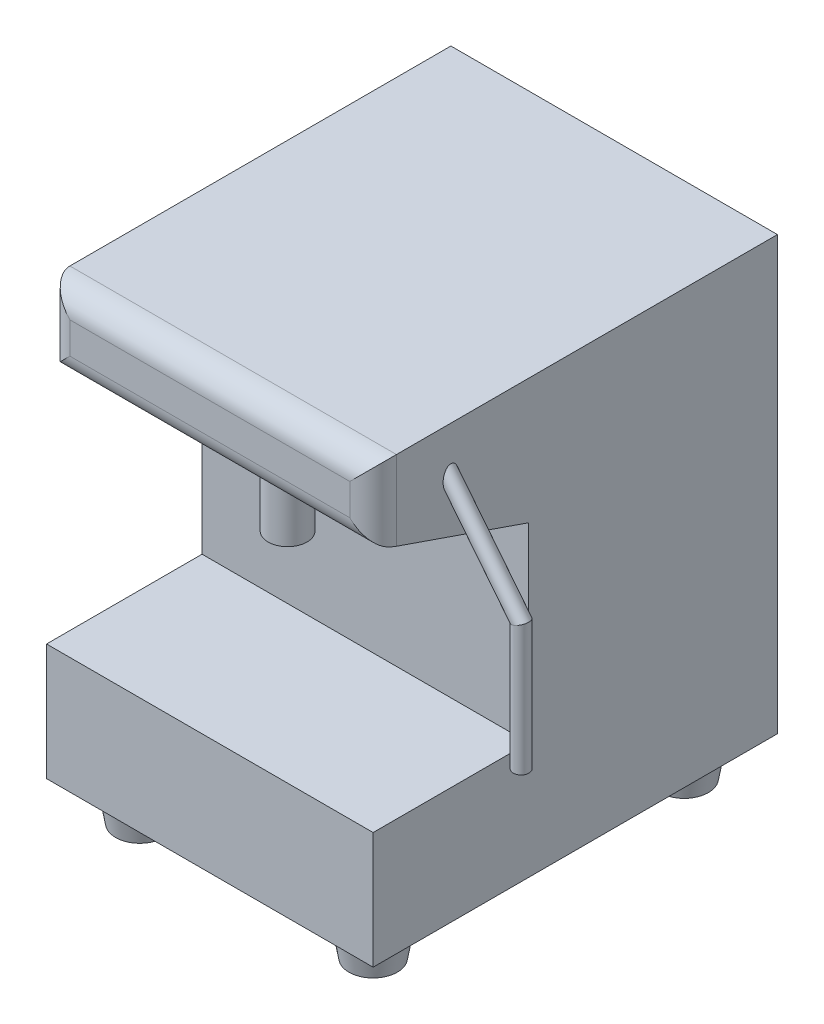
ISO-10303-21;
HEADER;
FILE_DESCRIPTION(('STEP AP214'),'2;1');
FILE_NAME('part.step','',(''),(''),'','','');
FILE_SCHEMA(('AUTOMOTIVE_DESIGN { 1 0 10303 214 1 1 1 1 }'));
ENDSEC;
DATA;
#1=APPLICATION_CONTEXT('core data for automotive mechanical design processes');
#2=APPLICATION_PROTOCOL_DEFINITION('international standard','automotive_design',2000,#1);
#3=PRODUCT_CONTEXT('',#1,'mechanical');
#4=PRODUCT('Part','Part','',(#3));
#5=PRODUCT_RELATED_PRODUCT_CATEGORY('part','',(#4));
#6=PRODUCT_DEFINITION_FORMATION('','',#4);
#7=PRODUCT_DEFINITION_CONTEXT('part definition',#1,'design');
#8=PRODUCT_DEFINITION('design','',#6,#7);
#9=PRODUCT_DEFINITION_SHAPE('','',#8);
#10=(LENGTH_UNIT() NAMED_UNIT(*) SI_UNIT(.MILLI.,.METRE.));
#11=(NAMED_UNIT(*) PLANE_ANGLE_UNIT() SI_UNIT($,.RADIAN.));
#12=(NAMED_UNIT(*) SI_UNIT($,.STERADIAN.) SOLID_ANGLE_UNIT());
#13=UNCERTAINTY_MEASURE_WITH_UNIT(LENGTH_MEASURE(1.E-05),#10,'distance_accuracy_value','');
#14=(GEOMETRIC_REPRESENTATION_CONTEXT(3) GLOBAL_UNCERTAINTY_ASSIGNED_CONTEXT((#13)) GLOBAL_UNIT_ASSIGNED_CONTEXT((#10,
#11,#12)) REPRESENTATION_CONTEXT('',''));
#15=CARTESIAN_POINT('',(0.,0.,0.));
#16=DIRECTION('',(0.,0.,1.));
#17=DIRECTION('',(1.,0.,0.));
#18=AXIS2_PLACEMENT_3D('',#15,#16,#17);
#19=CARTESIAN_POINT('',(0.,556.,0.));
#20=DIRECTION('',(0.,0.,-1.));
#21=DIRECTION('',(-1.,0.,0.));
#22=AXIS2_PLACEMENT_3D('',#19,#20,#21);
#23=PLANE('',#22);
#24=DIRECTION('',(0.,-1.,0.));
#25=VECTOR('',#24,1.);
#26=CARTESIAN_POINT('',(390.,556.,0.));
#27=LINE('',#26,#25);
#28=CARTESIAN_POINT('',(390.,485.558611887792,0.));
#29=VERTEX_POINT('',#28);
#30=CARTESIAN_POINT('',(390.,526.,0.));
#31=VERTEX_POINT('',#30);
#32=EDGE_CURVE('E178',#29,#31,#27,.F.);
#33=ORIENTED_EDGE('',*,*,#32,.T.);
#34=DIRECTION('',(1.,0.,0.));
#35=VECTOR('',#34,1.);
#36=CARTESIAN_POINT('',(0.,526.,0.));
#37=LINE('',#36,#35);
#38=CARTESIAN_POINT('',(30.,526.,0.));
#39=VERTEX_POINT('',#38);
#40=EDGE_CURVE('E181',#31,#39,#37,.F.);
#41=ORIENTED_EDGE('',*,*,#40,.T.);
#42=DIRECTION('',(0.,-1.,0.));
#43=VECTOR('',#42,1.);
#44=CARTESIAN_POINT('',(30.,556.,0.));
#45=LINE('',#44,#43);
#46=CARTESIAN_POINT('',(30.,485.558611887792,0.));
#47=VERTEX_POINT('',#46);
#48=EDGE_CURVE('E167',#39,#47,#45,.T.);
#49=ORIENTED_EDGE('',*,*,#48,.T.);
#50=DIRECTION('',(1.,0.,0.));
#51=VECTOR('',#50,1.);
#52=CARTESIAN_POINT('',(0.,485.558611887792,0.));
#53=LINE('',#52,#51);
#54=EDGE_CURVE('E175',#47,#29,#53,.T.);
#55=ORIENTED_EDGE('',*,*,#54,.T.);
#56=EDGE_LOOP('',(#33,#41,#49,#55));
#57=FACE_BOUND('',#56,.T.);
#58=ADVANCED_FACE('F48',(#57),#23,.F.);
#59=CARTESIAN_POINT('',(0.,556.,0.));
#60=DIRECTION('',(1.,0.,0.));
#61=DIRECTION('',(0.,0.,-1.));
#62=AXIS2_PLACEMENT_3D('',#59,#60,#61);
#63=PLANE('',#62);
#64=DIRECTION('',(0.,0.326950789305376,0.945041364900284));
#65=VECTOR('',#64,1.);
#66=CARTESIAN_POINT('',(0.,464.192905506284,0.));
#67=LINE('',#66,#65);
#68=CARTESIAN_POINT('',(0.,395.,-200.));
#69=VERTEX_POINT('',#68);
#70=CARTESIAN_POINT('',(0.,453.813969680342,-30.));
#71=VERTEX_POINT('',#70);
#72=EDGE_CURVE('E153',#69,#71,#67,.T.);
#73=ORIENTED_EDGE('',*,*,#72,.T.);
#74=DIRECTION('',(0.,-1.,0.));
#75=VECTOR('',#74,1.);
#76=CARTESIAN_POINT('',(0.,556.,-30.));
#77=LINE('',#76,#75);
#78=CARTESIAN_POINT('',(0.,556.,-30.));
#79=VERTEX_POINT('',#78);
#80=EDGE_CURVE('E12',#71,#79,#77,.F.);
#81=ORIENTED_EDGE('',*,*,#80,.T.);
#82=DIRECTION('',(0.,0.,1.));
#83=VECTOR('',#82,1.);
#84=CARTESIAN_POINT('',(0.,556.,0.));
#85=LINE('',#84,#83);
#86=CARTESIAN_POINT('',(0.,556.,-520.));
#87=VERTEX_POINT('',#86);
#88=EDGE_CURVE('E229',#87,#79,#85,.T.);
#89=ORIENTED_EDGE('',*,*,#88,.F.);
#90=DIRECTION('',(0.,-1.,0.));
#91=VECTOR('',#90,1.);
#92=CARTESIAN_POINT('',(0.,556.,-520.));
#93=LINE('',#92,#91);
#94=CARTESIAN_POINT('',(0.,0.,-520.));
#95=VERTEX_POINT('',#94);
#96=EDGE_CURVE('E240',#87,#95,#93,.T.);
#97=ORIENTED_EDGE('',*,*,#96,.T.);
#98=DIRECTION('',(0.,0.,1.));
#99=VECTOR('',#98,1.);
#100=CARTESIAN_POINT('',(0.,0.,0.));
#101=LINE('',#100,#99);
#102=CARTESIAN_POINT('',(0.,0.,0.));
#103=VERTEX_POINT('',#102);
#104=EDGE_CURVE('E160',#95,#103,#101,.T.);
#105=ORIENTED_EDGE('',*,*,#104,.T.);
#106=DIRECTION('',(0.,-1.,0.));
#107=VECTOR('',#106,1.);
#108=CARTESIAN_POINT('',(0.,556.,0.));
#109=LINE('',#108,#107);
#110=CARTESIAN_POINT('',(0.,150.,0.));
#111=VERTEX_POINT('',#110);
#112=EDGE_CURVE('E149',#111,#103,#109,.T.);
#113=ORIENTED_EDGE('',*,*,#112,.F.);
#114=DIRECTION('',(0.,0.,-1.));
#115=VECTOR('',#114,1.);
#116=CARTESIAN_POINT('',(0.,150.,0.));
#117=LINE('',#116,#115);
#118=CARTESIAN_POINT('',(0.,150.,-200.));
#119=VERTEX_POINT('',#118);
#120=EDGE_CURVE('E130',#111,#119,#117,.T.);
#121=ORIENTED_EDGE('',*,*,#120,.T.);
#122=DIRECTION('',(0.,1.,0.));
#123=VECTOR('',#122,1.);
#124=CARTESIAN_POINT('',(0.,150.,-200.));
#125=LINE('',#124,#123);
#126=EDGE_CURVE('E142',#119,#69,#125,.T.);
#127=ORIENTED_EDGE('',*,*,#126,.T.);
#128=EDGE_LOOP('',(#73,#81,#89,#97,#105,#113,#121,#127));
#129=FACE_BOUND('',#128,.T.);
#130=ADVANCED_FACE('F157',(#129),#63,.F.);
#131=DIRECTION('',(0.,-1.,0.));
#132=VECTOR('',#131,1.);
#133=CARTESIAN_POINT('',(420.,556.,0.));
#134=LINE('',#133,#132);
#135=CARTESIAN_POINT('',(420.,150.,0.));
#136=VERTEX_POINT('',#135);
#137=CARTESIAN_POINT('',(420.,0.,0.));
#138=VERTEX_POINT('',#137);
#139=EDGE_CURVE('E151',#136,#138,#134,.T.);
#140=ORIENTED_EDGE('',*,*,#139,.F.);
#141=DIRECTION('',(1.,0.,0.));
#142=VECTOR('',#141,1.);
#143=CARTESIAN_POINT('',(0.,150.,0.));
#144=LINE('',#143,#142);
#145=EDGE_CURVE('E134',#111,#136,#144,.T.);
#146=ORIENTED_EDGE('',*,*,#145,.F.);
#147=ORIENTED_EDGE('',*,*,#112,.T.);
#148=DIRECTION('',(1.,0.,0.));
#149=VECTOR('',#148,1.);
#150=CARTESIAN_POINT('',(0.,0.,0.));
#151=LINE('',#150,#149);
#152=EDGE_CURVE('E243',#103,#138,#151,.T.);
#153=ORIENTED_EDGE('',*,*,#152,.T.);
#154=EDGE_LOOP('',(#140,#146,#147,#153));
#155=FACE_BOUND('',#154,.T.);
#156=ADVANCED_FACE('F147',(#155),#23,.F.);
#157=CARTESIAN_POINT('',(420.,556.,0.));
#158=DIRECTION('',(-1.,0.,0.));
#159=DIRECTION('',(0.,0.,1.));
#160=AXIS2_PLACEMENT_3D('',#157,#158,#159);
#161=PLANE('',#160);
#162=CARTESIAN_POINT('',(420.,494.703752628212,-100.));
#163=DIRECTION('',(-1.,0.,0.));
#164=DIRECTION('',(0.,-1.,0.));
#165=AXIS2_PLACEMENT_3D('',#162,#163,#164);
#166=ELLIPSE('',#165,16.0713877847574,10.);
#167=CARTESIAN_POINT('',(420.,478.632364843454,-100.));
#168=VERTEX_POINT('',#167);
#169=EDGE_CURVE('E308',#168,#168,#166,.T.);
#170=ORIENTED_EDGE('',*,*,#169,.T.);
#171=EDGE_LOOP('',(#170));
#172=FACE_BOUND('',#171,.T.);
#173=DIRECTION('',(0.,0.,-1.));
#174=VECTOR('',#173,1.);
#175=CARTESIAN_POINT('',(420.,556.,0.));
#176=LINE('',#175,#174);
#177=CARTESIAN_POINT('',(420.,556.,-30.));
#178=VERTEX_POINT('',#177);
#179=CARTESIAN_POINT('',(420.,556.,-520.));
#180=VERTEX_POINT('',#179);
#181=EDGE_CURVE('E233',#178,#180,#176,.T.);
#182=ORIENTED_EDGE('',*,*,#181,.F.);
#183=DIRECTION('',(0.,-1.,0.));
#184=VECTOR('',#183,1.);
#185=CARTESIAN_POINT('',(420.,556.,-30.));
#186=LINE('',#185,#184);
#187=CARTESIAN_POINT('',(420.,453.813969680342,-30.));
#188=VERTEX_POINT('',#187);
#189=EDGE_CURVE('E185',#178,#188,#186,.T.);
#190=ORIENTED_EDGE('',*,*,#189,.T.);
#191=DIRECTION('',(0.,0.326950789305376,0.945041364900284));
#192=VECTOR('',#191,1.);
#193=CARTESIAN_POINT('',(420.,464.192905506284,0.));
#194=LINE('',#193,#192);
#195=CARTESIAN_POINT('',(420.,395.,-200.));
#196=VERTEX_POINT('',#195);
#197=EDGE_CURVE('E143',#196,#188,#194,.T.);
#198=ORIENTED_EDGE('',*,*,#197,.F.);
#199=DIRECTION('',(0.,1.,0.));
#200=VECTOR('',#199,1.);
#201=CARTESIAN_POINT('',(420.,150.,-200.));
#202=LINE('',#201,#200);
#203=CARTESIAN_POINT('',(420.,150.,-200.));
#204=VERTEX_POINT('',#203);
#205=EDGE_CURVE('E213',#204,#196,#202,.T.);
#206=ORIENTED_EDGE('',*,*,#205,.F.);
#207=DIRECTION('',(0.,0.,-1.));
#208=VECTOR('',#207,1.);
#209=CARTESIAN_POINT('',(420.,150.,0.));
#210=LINE('',#209,#208);
#211=EDGE_CURVE('E208',#136,#204,#210,.T.);
#212=ORIENTED_EDGE('',*,*,#211,.F.);
#213=ORIENTED_EDGE('',*,*,#139,.T.);
#214=DIRECTION('',(0.,0.,-1.));
#215=VECTOR('',#214,1.);
#216=CARTESIAN_POINT('',(420.,0.,0.));
#217=LINE('',#216,#215);
#218=CARTESIAN_POINT('',(420.,0.,-520.));
#219=VERTEX_POINT('',#218);
#220=EDGE_CURVE('E246',#138,#219,#217,.T.);
#221=ORIENTED_EDGE('',*,*,#220,.T.);
#222=DIRECTION('',(0.,-1.,0.));
#223=VECTOR('',#222,1.);
#224=CARTESIAN_POINT('',(420.,556.,-520.));
#225=LINE('',#224,#223);
#226=EDGE_CURVE('E169',#180,#219,#225,.T.);
#227=ORIENTED_EDGE('',*,*,#226,.F.);
#228=EDGE_LOOP('',(#182,#190,#198,#206,#212,#213,#221,#227));
#229=FACE_BOUND('',#228,.T.);
#230=ADVANCED_FACE('F265',(#172,#229),#161,.F.);
#231=CARTESIAN_POINT('',(0.,556.,-520.));
#232=DIRECTION('',(0.,0.,1.));
#233=DIRECTION('',(1.,0.,0.));
#234=AXIS2_PLACEMENT_3D('',#231,#232,#233);
#235=PLANE('',#234);
#236=DIRECTION('',(-1.,0.,0.));
#237=VECTOR('',#236,1.);
#238=CARTESIAN_POINT('',(0.,0.,-520.));
#239=LINE('',#238,#237);
#240=EDGE_CURVE('E234',#219,#95,#239,.T.);
#241=ORIENTED_EDGE('',*,*,#240,.T.);
#242=ORIENTED_EDGE('',*,*,#96,.F.);
#243=DIRECTION('',(-1.,0.,0.));
#244=VECTOR('',#243,1.);
#245=CARTESIAN_POINT('',(0.,556.,-520.));
#246=LINE('',#245,#244);
#247=EDGE_CURVE('E237',#180,#87,#246,.T.);
#248=ORIENTED_EDGE('',*,*,#247,.F.);
#249=ORIENTED_EDGE('',*,*,#226,.T.);
#250=EDGE_LOOP('',(#241,#242,#248,#249));
#251=FACE_BOUND('',#250,.T.);
#252=ADVANCED_FACE('F258',(#251),#235,.F.);
#253=CARTESIAN_POINT('',(0.,556.,0.));
#254=DIRECTION('',(0.,-1.,0.));
#255=DIRECTION('',(0.,0.,-1.));
#256=AXIS2_PLACEMENT_3D('',#253,#254,#255);
#257=PLANE('',#256);
#258=ORIENTED_EDGE('',*,*,#88,.T.);
#259=DIRECTION('',(1.,0.,0.));
#260=VECTOR('',#259,1.);
#261=CARTESIAN_POINT('',(0.,556.,-30.));
#262=LINE('',#261,#260);
#263=EDGE_CURVE('E162',#79,#178,#262,.T.);
#264=ORIENTED_EDGE('',*,*,#263,.T.);
#265=ORIENTED_EDGE('',*,*,#181,.T.);
#266=ORIENTED_EDGE('',*,*,#247,.T.);
#267=EDGE_LOOP('',(#258,#264,#265,#266));
#268=FACE_BOUND('',#267,.T.);
#269=ADVANCED_FACE('F352',(#268),#257,.F.);
#270=CARTESIAN_POINT('',(0.,0.,0.));
#271=DIRECTION('',(0.,-1.,0.));
#272=DIRECTION('',(0.,0.,-1.));
#273=AXIS2_PLACEMENT_3D('',#270,#271,#272);
#274=PLANE('',#273);
#275=CARTESIAN_POINT('',(60.,0.,-460.));
#276=DIRECTION('',(0.,-1.,0.));
#277=DIRECTION('',(0.,0.,1.));
#278=AXIS2_PLACEMENT_3D('',#275,#276,#277);
#279=CIRCLE('',#278,40.);
#280=CARTESIAN_POINT('',(60.,0.,-420.));
#281=VERTEX_POINT('',#280);
#282=EDGE_CURVE('E296',#281,#281,#279,.T.);
#283=ORIENTED_EDGE('',*,*,#282,.F.);
#284=EDGE_LOOP('',(#283));
#285=FACE_BOUND('',#284,.T.);
#286=CARTESIAN_POINT('',(360.,0.,-460.));
#287=DIRECTION('',(0.,-1.,0.));
#288=DIRECTION('',(0.,0.,-1.));
#289=AXIS2_PLACEMENT_3D('',#286,#287,#288);
#290=CIRCLE('',#289,40.);
#291=CARTESIAN_POINT('',(360.,0.,-500.));
#292=VERTEX_POINT('',#291);
#293=EDGE_CURVE('E288',#292,#292,#290,.T.);
#294=ORIENTED_EDGE('',*,*,#293,.F.);
#295=EDGE_LOOP('',(#294));
#296=FACE_BOUND('',#295,.T.);
#297=CARTESIAN_POINT('',(360.,0.,-60.));
#298=DIRECTION('',(0.,-1.,0.));
#299=DIRECTION('',(0.,0.,1.));
#300=AXIS2_PLACEMENT_3D('',#297,#298,#299);
#301=CIRCLE('',#300,40.);
#302=CARTESIAN_POINT('',(360.,0.,-20.));
#303=VERTEX_POINT('',#302);
#304=EDGE_CURVE('E280',#303,#303,#301,.T.);
#305=ORIENTED_EDGE('',*,*,#304,.F.);
#306=EDGE_LOOP('',(#305));
#307=FACE_BOUND('',#306,.T.);
#308=CARTESIAN_POINT('',(60.,0.,-60.));
#309=DIRECTION('',(0.,-1.,0.));
#310=DIRECTION('',(0.,0.,-1.));
#311=AXIS2_PLACEMENT_3D('',#308,#309,#310);
#312=CIRCLE('',#311,40.);
#313=CARTESIAN_POINT('',(60.,0.,-100.));
#314=VERTEX_POINT('',#313);
#315=EDGE_CURVE('E276',#314,#314,#312,.T.);
#316=ORIENTED_EDGE('',*,*,#315,.F.);
#317=EDGE_LOOP('',(#316));
#318=FACE_BOUND('',#317,.T.);
#319=ORIENTED_EDGE('',*,*,#104,.F.);
#320=ORIENTED_EDGE('',*,*,#240,.F.);
#321=ORIENTED_EDGE('',*,*,#220,.F.);
#322=ORIENTED_EDGE('',*,*,#152,.F.);
#323=EDGE_LOOP('',(#319,#320,#321,#322));
#324=FACE_BOUND('',#323,.T.);
#325=ADVANCED_FACE('F264',(#285,#296,#307,#318,#324),#274,.T.);
#326=CARTESIAN_POINT('',(0.,464.192905506284,0.));
#327=DIRECTION('',(0.,0.945041364900284,-0.326950789305376));
#328=DIRECTION('',(0.,0.326950789305376,0.945041364900284));
#329=AXIS2_PLACEMENT_3D('',#326,#327,#328);
#330=PLANE('',#329);
#331=CARTESIAN_POINT('',(210.,429.596452753142,-100.));
#332=DIRECTION('',(0.,0.945041364900284,-0.326950789305376));
#333=DIRECTION('',(0.,0.326950789305376,0.945041364900284));
#334=AXIS2_PLACEMENT_3D('',#331,#332,#333);
#335=ELLIPSE('',#334,26.4538685062086,25.);
#336=CARTESIAN_POINT('',(210.,438.245565941428,-75.));
#337=VERTEX_POINT('',#336);
#338=EDGE_CURVE('E52',#337,#337,#335,.T.);
#339=ORIENTED_EDGE('',*,*,#338,.T.);
#340=EDGE_LOOP('',(#339));
#341=FACE_BOUND('',#340,.T.);
#342=ORIENTED_EDGE('',*,*,#197,.T.);
#343=CARTESIAN_POINT('',(390.,453.813969680342,-30.));
#344=DIRECTION('',(0.,0.945041364900284,-0.326950789305376));
#345=DIRECTION('',(0.,-0.326950789305376,-0.945041364900284));
#346=AXIS2_PLACEMENT_3D('',#343,#344,#345);
#347=ELLIPSE('',#346,31.7446422074503,30.);
#348=CARTESIAN_POINT('',(418.351240947009,457.207370940783,-20.1914763208387));
#349=VERTEX_POINT('',#348);
#350=EDGE_CURVE('E58',#188,#349,#347,.F.);
#351=ORIENTED_EDGE('',*,*,#350,.T.);
#352=DIRECTION('',(1.,0.,0.));
#353=VECTOR('',#352,1.);
#354=CARTESIAN_POINT('',(0.,457.207370940783,-20.1914763208387));
#355=LINE('',#354,#353);
#356=CARTESIAN_POINT('',(1.64875905299149,457.207370940783,-20.1914763208387));
#357=VERTEX_POINT('',#356);
#358=EDGE_CURVE('E69',#349,#357,#355,.F.);
#359=ORIENTED_EDGE('',*,*,#358,.T.);
#360=CARTESIAN_POINT('',(30.,453.813969680342,-30.));
#361=DIRECTION('',(0.,0.945041364900284,-0.326950789305376));
#362=DIRECTION('',(0.,-0.326950789305376,-0.945041364900284));
#363=AXIS2_PLACEMENT_3D('',#360,#361,#362);
#364=ELLIPSE('',#363,31.7446422074503,30.);
#365=EDGE_CURVE('E188',#357,#71,#364,.F.);
#366=ORIENTED_EDGE('',*,*,#365,.T.);
#367=ORIENTED_EDGE('',*,*,#72,.F.);
#368=DIRECTION('',(1.,0.,0.));
#369=VECTOR('',#368,1.);
#370=CARTESIAN_POINT('',(0.,395.,-200.));
#371=LINE('',#370,#369);
#372=EDGE_CURVE('E224',#69,#196,#371,.T.);
#373=ORIENTED_EDGE('',*,*,#372,.T.);
#374=EDGE_LOOP('',(#342,#351,#359,#366,#367,#373));
#375=FACE_BOUND('',#374,.T.);
#376=ADVANCED_FACE('F357',(#341,#375),#330,.F.);
#377=CARTESIAN_POINT('',(0.,150.,-200.));
#378=DIRECTION('',(0.,0.,-1.));
#379=DIRECTION('',(-1.,0.,0.));
#380=AXIS2_PLACEMENT_3D('',#377,#378,#379);
#381=PLANE('',#380);
#382=ORIENTED_EDGE('',*,*,#205,.T.);
#383=ORIENTED_EDGE('',*,*,#372,.F.);
#384=ORIENTED_EDGE('',*,*,#126,.F.);
#385=DIRECTION('',(1.,0.,0.));
#386=VECTOR('',#385,1.);
#387=CARTESIAN_POINT('',(0.,150.,-200.));
#388=LINE('',#387,#386);
#389=EDGE_CURVE('E136',#119,#204,#388,.T.);
#390=ORIENTED_EDGE('',*,*,#389,.T.);
#391=EDGE_LOOP('',(#382,#383,#384,#390));
#392=FACE_BOUND('',#391,.T.);
#393=ADVANCED_FACE('F268',(#392),#381,.F.);
#394=CARTESIAN_POINT('',(0.,150.,0.));
#395=DIRECTION('',(0.,-1.,0.));
#396=DIRECTION('',(0.,0.,-1.));
#397=AXIS2_PLACEMENT_3D('',#394,#395,#396);
#398=PLANE('',#397);
#399=ORIENTED_EDGE('',*,*,#211,.T.);
#400=ORIENTED_EDGE('',*,*,#389,.F.);
#401=ORIENTED_EDGE('',*,*,#120,.F.);
#402=ORIENTED_EDGE('',*,*,#145,.T.);
#403=EDGE_LOOP('',(#399,#400,#401,#402));
#404=FACE_BOUND('',#403,.T.);
#405=ADVANCED_FACE('F133',(#404),#398,.F.);
#406=CARTESIAN_POINT('',(0.,485.558611887792,-30.));
#407=DIRECTION('',(1.,0.,0.));
#408=DIRECTION('',(0.,0.,-1.));
#409=AXIS2_PLACEMENT_3D('',#406,#407,#408);
#410=CYLINDRICAL_SURFACE('',#409,30.);
#411=CARTESIAN_POINT('',(390.,485.558611887792,-30.));
#412=DIRECTION('',(0.707106781186547,0.707106781186547,0.));
#413=DIRECTION('',(0.707106781186547,-0.707106781186547,0.));
#414=AXIS2_PLACEMENT_3D('',#411,#412,#413);
#415=ELLIPSE('',#414,42.4264068711928,30.);
#416=EDGE_CURVE('E202',#29,#349,#415,.T.);
#417=ORIENTED_EDGE('',*,*,#416,.F.);
#418=ORIENTED_EDGE('',*,*,#54,.F.);
#419=CARTESIAN_POINT('',(30.,485.558611887792,-30.));
#420=DIRECTION('',(0.707106781186547,-0.707106781186547,0.));
#421=DIRECTION('',(-0.707106781186547,-0.707106781186547,0.));
#422=AXIS2_PLACEMENT_3D('',#419,#420,#421);
#423=ELLIPSE('',#422,42.4264068711928,30.);
#424=EDGE_CURVE('E205',#357,#47,#423,.F.);
#425=ORIENTED_EDGE('',*,*,#424,.F.);
#426=ORIENTED_EDGE('',*,*,#358,.F.);
#427=EDGE_LOOP('',(#417,#418,#425,#426));
#428=FACE_BOUND('',#427,.T.);
#429=ADVANCED_FACE('F50',(#428),#410,.T.);
#430=CARTESIAN_POINT('',(30.,556.,-30.));
#431=DIRECTION('',(0.,-1.,0.));
#432=DIRECTION('',(0.,0.,-1.));
#433=AXIS2_PLACEMENT_3D('',#430,#431,#432);
#434=CYLINDRICAL_SURFACE('',#433,30.);
#435=ORIENTED_EDGE('',*,*,#424,.T.);
#436=ORIENTED_EDGE('',*,*,#48,.F.);
#437=CARTESIAN_POINT('',(30.,526.,-30.));
#438=DIRECTION('',(-0.707106781186547,-0.707106781186547,0.));
#439=DIRECTION('',(0.707106781186547,-0.707106781186547,0.));
#440=AXIS2_PLACEMENT_3D('',#437,#438,#439);
#441=ELLIPSE('',#440,42.4264068711928,30.);
#442=EDGE_CURVE('E198',#79,#39,#441,.F.);
#443=ORIENTED_EDGE('',*,*,#442,.F.);
#444=ORIENTED_EDGE('',*,*,#80,.F.);
#445=ORIENTED_EDGE('',*,*,#365,.F.);
#446=EDGE_LOOP('',(#435,#436,#443,#444,#445));
#447=FACE_BOUND('',#446,.T.);
#448=ADVANCED_FACE('F424',(#447),#434,.T.);
#449=CARTESIAN_POINT('',(390.,556.,-30.));
#450=DIRECTION('',(0.,-1.,0.));
#451=DIRECTION('',(0.,0.,-1.));
#452=AXIS2_PLACEMENT_3D('',#449,#450,#451);
#453=CYLINDRICAL_SURFACE('',#452,30.);
#454=ORIENTED_EDGE('',*,*,#350,.F.);
#455=ORIENTED_EDGE('',*,*,#189,.F.);
#456=CARTESIAN_POINT('',(390.,526.,-30.));
#457=DIRECTION('',(0.707106781186547,-0.707106781186547,0.));
#458=DIRECTION('',(-0.707106781186547,-0.707106781186547,0.));
#459=AXIS2_PLACEMENT_3D('',#456,#457,#458);
#460=ELLIPSE('',#459,42.4264068711928,30.);
#461=EDGE_CURVE('E195',#31,#178,#460,.F.);
#462=ORIENTED_EDGE('',*,*,#461,.F.);
#463=ORIENTED_EDGE('',*,*,#32,.F.);
#464=ORIENTED_EDGE('',*,*,#416,.T.);
#465=EDGE_LOOP('',(#454,#455,#462,#463,#464));
#466=FACE_BOUND('',#465,.T.);
#467=ADVANCED_FACE('F417',(#466),#453,.T.);
#468=CARTESIAN_POINT('',(0.,526.,-30.));
#469=DIRECTION('',(1.,0.,0.));
#470=DIRECTION('',(0.,0.,-1.));
#471=AXIS2_PLACEMENT_3D('',#468,#469,#470);
#472=CYLINDRICAL_SURFACE('',#471,30.);
#473=ORIENTED_EDGE('',*,*,#442,.T.);
#474=ORIENTED_EDGE('',*,*,#40,.F.);
#475=ORIENTED_EDGE('',*,*,#461,.T.);
#476=ORIENTED_EDGE('',*,*,#263,.F.);
#477=EDGE_LOOP('',(#473,#474,#475,#476));
#478=FACE_BOUND('',#477,.T.);
#479=ADVANCED_FACE('F373',(#478),#472,.T.);
#480=CARTESIAN_POINT('',(60.,0.,-60.));
#481=DIRECTION('',(0.,1.,0.));
#482=DIRECTION('',(0.,0.,-1.));
#483=AXIS2_PLACEMENT_3D('',#480,#481,#482);
#484=CONICAL_SURFACE('',#483,40.,0.174532925199433);
#485=CARTESIAN_POINT('',(60.,-50.,-60.));
#486=DIRECTION('',(0.,-1.,0.));
#487=DIRECTION('',(0.,0.,-1.));
#488=AXIS2_PLACEMENT_3D('',#485,#486,#487);
#489=CIRCLE('',#488,31.1836509645768);
#490=CARTESIAN_POINT('',(60.,-50.,-91.1836509645768));
#491=VERTEX_POINT('',#490);
#492=EDGE_CURVE('E199',#491,#491,#489,.T.);
#493=ORIENTED_EDGE('',*,*,#492,.F.);
#494=EDGE_LOOP('',(#493));
#495=FACE_BOUND('',#494,.T.);
#496=ORIENTED_EDGE('',*,*,#315,.T.);
#497=EDGE_LOOP('',(#496));
#498=FACE_BOUND('',#497,.T.);
#499=ADVANCED_FACE('F369',(#495,#498),#484,.T.);
#500=CARTESIAN_POINT('',(60.,-50.,-60.));
#501=DIRECTION('',(0.,-1.,0.));
#502=DIRECTION('',(0.,0.,-1.));
#503=AXIS2_PLACEMENT_3D('',#500,#501,#502);
#504=PLANE('',#503);
#505=ORIENTED_EDGE('',*,*,#492,.T.);
#506=EDGE_LOOP('',(#505));
#507=FACE_BOUND('',#506,.T.);
#508=ADVANCED_FACE('F372',(#507),#504,.T.);
#509=CARTESIAN_POINT('',(360.,0.,-60.));
#510=DIRECTION('',(0.,1.,0.));
#511=DIRECTION('',(0.,0.,1.));
#512=AXIS2_PLACEMENT_3D('',#509,#510,#511);
#513=CONICAL_SURFACE('',#512,40.,0.174532925199433);
#514=CARTESIAN_POINT('',(360.,-50.,-60.));
#515=DIRECTION('',(0.,1.,0.));
#516=DIRECTION('',(0.,0.,1.));
#517=AXIS2_PLACEMENT_3D('',#514,#515,#516);
#518=CIRCLE('',#517,31.1836509645768);
#519=CARTESIAN_POINT('',(360.,-50.,-28.8163490354232));
#520=VERTEX_POINT('',#519);
#521=EDGE_CURVE('E284',#520,#520,#518,.F.);
#522=ORIENTED_EDGE('',*,*,#521,.F.);
#523=EDGE_LOOP('',(#522));
#524=FACE_BOUND('',#523,.T.);
#525=ORIENTED_EDGE('',*,*,#304,.T.);
#526=EDGE_LOOP('',(#525));
#527=FACE_BOUND('',#526,.T.);
#528=ADVANCED_FACE('F377',(#524,#527),#513,.T.);
#529=CARTESIAN_POINT('',(360.,-50.,-60.));
#530=DIRECTION('',(0.,1.,0.));
#531=DIRECTION('',(0.,0.,1.));
#532=AXIS2_PLACEMENT_3D('',#529,#530,#531);
#533=PLANE('',#532);
#534=ORIENTED_EDGE('',*,*,#521,.T.);
#535=EDGE_LOOP('',(#534));
#536=FACE_BOUND('',#535,.T.);
#537=ADVANCED_FACE('F379',(#536),#533,.F.);
#538=CARTESIAN_POINT('',(360.,0.,-460.));
#539=DIRECTION('',(0.,1.,0.));
#540=DIRECTION('',(0.,0.,-1.));
#541=AXIS2_PLACEMENT_3D('',#538,#539,#540);
#542=CONICAL_SURFACE('',#541,40.,0.174532925199433);
#543=CARTESIAN_POINT('',(360.,-50.,-460.));
#544=DIRECTION('',(0.,-1.,0.));
#545=DIRECTION('',(0.,0.,-1.));
#546=AXIS2_PLACEMENT_3D('',#543,#544,#545);
#547=CIRCLE('',#546,31.1836509645768);
#548=CARTESIAN_POINT('',(360.,-50.,-491.183650964577));
#549=VERTEX_POINT('',#548);
#550=EDGE_CURVE('E292',#549,#549,#547,.T.);
#551=ORIENTED_EDGE('',*,*,#550,.F.);
#552=EDGE_LOOP('',(#551));
#553=FACE_BOUND('',#552,.T.);
#554=ORIENTED_EDGE('',*,*,#293,.T.);
#555=EDGE_LOOP('',(#554));
#556=FACE_BOUND('',#555,.T.);
#557=ADVANCED_FACE('F382',(#553,#556),#542,.T.);
#558=CARTESIAN_POINT('',(360.,-50.,-460.));
#559=DIRECTION('',(0.,-1.,0.));
#560=DIRECTION('',(0.,0.,-1.));
#561=AXIS2_PLACEMENT_3D('',#558,#559,#560);
#562=PLANE('',#561);
#563=ORIENTED_EDGE('',*,*,#550,.T.);
#564=EDGE_LOOP('',(#563));
#565=FACE_BOUND('',#564,.T.);
#566=ADVANCED_FACE('F387',(#565),#562,.T.);
#567=CARTESIAN_POINT('',(60.,0.,-460.));
#568=DIRECTION('',(0.,1.,0.));
#569=DIRECTION('',(0.,0.,1.));
#570=AXIS2_PLACEMENT_3D('',#567,#568,#569);
#571=CONICAL_SURFACE('',#570,40.,0.174532925199433);
#572=CARTESIAN_POINT('',(60.,-50.,-460.));
#573=DIRECTION('',(0.,1.,0.));
#574=DIRECTION('',(0.,0.,1.));
#575=AXIS2_PLACEMENT_3D('',#572,#573,#574);
#576=CIRCLE('',#575,31.1836509645767);
#577=CARTESIAN_POINT('',(60.,-50.,-428.816349035423));
#578=VERTEX_POINT('',#577);
#579=EDGE_CURVE('E300',#578,#578,#576,.F.);
#580=ORIENTED_EDGE('',*,*,#579,.F.);
#581=EDGE_LOOP('',(#580));
#582=FACE_BOUND('',#581,.T.);
#583=ORIENTED_EDGE('',*,*,#282,.T.);
#584=EDGE_LOOP('',(#583));
#585=FACE_BOUND('',#584,.T.);
#586=ADVANCED_FACE('F390',(#582,#585),#571,.T.);
#587=CARTESIAN_POINT('',(60.,-50.,-460.));
#588=DIRECTION('',(0.,1.,0.));
#589=DIRECTION('',(0.,0.,1.));
#590=AXIS2_PLACEMENT_3D('',#587,#588,#589);
#591=PLANE('',#590);
#592=ORIENTED_EDGE('',*,*,#579,.T.);
#593=EDGE_LOOP('',(#592));
#594=FACE_BOUND('',#593,.T.);
#595=ADVANCED_FACE('F395',(#594),#591,.F.);
#596=CARTESIAN_POINT('',(210.,331.,-100.));
#597=DIRECTION('',(0.,1.,0.));
#598=DIRECTION('',(0.,0.,1.));
#599=AXIS2_PLACEMENT_3D('',#596,#597,#598);
#600=CYLINDRICAL_SURFACE('',#599,25.);
#601=CARTESIAN_POINT('',(210.,331.,-100.));
#602=DIRECTION('',(0.,1.,0.));
#603=DIRECTION('',(0.,0.,1.));
#604=AXIS2_PLACEMENT_3D('',#601,#602,#603);
#605=CIRCLE('',#604,25.);
#606=CARTESIAN_POINT('',(210.,331.,-75.));
#607=VERTEX_POINT('',#606);
#608=EDGE_CURVE('E304',#607,#607,#605,.T.);
#609=ORIENTED_EDGE('',*,*,#608,.T.);
#610=EDGE_LOOP('',(#609));
#611=FACE_BOUND('',#610,.T.);
#612=ORIENTED_EDGE('',*,*,#338,.F.);
#613=EDGE_LOOP('',(#612));
#614=FACE_BOUND('',#613,.T.);
#615=ADVANCED_FACE('F398',(#611,#614),#600,.T.);
#616=CARTESIAN_POINT('',(210.,331.,-100.));
#617=DIRECTION('',(0.,1.,0.));
#618=DIRECTION('',(0.,0.,1.));
#619=AXIS2_PLACEMENT_3D('',#616,#617,#618);
#620=PLANE('',#619);
#621=ORIENTED_EDGE('',*,*,#608,.F.);
#622=EDGE_LOOP('',(#621));
#623=FACE_BOUND('',#622,.T.);
#624=ADVANCED_FACE('F333',(#623),#620,.F.);
#625=CARTESIAN_POINT('',(410.603852599767,506.525342330663,-100.));
#626=DIRECTION('',(0.622223801325007,-0.782839409498946,0.));
#627=DIRECTION('',(0.782839409498946,0.622223801325007,0.));
#628=AXIS2_PLACEMENT_3D('',#625,#626,#627);
#629=CYLINDRICAL_SURFACE('',#628,10.);
#630=CARTESIAN_POINT('',(510.353927905085,381.026623247266,-100.));
#631=DIRECTION('',(0.329515242819702,-0.944150255388131,0.));
#632=DIRECTION('',(0.944150255388131,0.329515242819702,0.));
#633=AXIS2_PLACEMENT_3D('',#630,#631,#632);
#634=ELLIPSE('',#633,10.5915344966878,10.);
#635=CARTESIAN_POINT('',(520.353927905085,384.516695308775,-100.));
#636=VERTEX_POINT('',#635);
#637=EDGE_CURVE('E313',#636,#636,#634,.T.);
#638=ORIENTED_EDGE('',*,*,#637,.F.);
#639=EDGE_LOOP('',(#638));
#640=FACE_BOUND('',#639,.T.);
#641=ORIENTED_EDGE('',*,*,#169,.F.);
#642=EDGE_LOOP('',(#641));
#643=FACE_BOUND('',#642,.T.);
#644=ADVANCED_FACE('F325',(#640,#643),#629,.T.);
#645=CARTESIAN_POINT('',(510.353927905085,216.291404885595,-100.));
#646=DIRECTION('',(0.,1.,0.));
#647=DIRECTION('',(0.,0.,1.));
#648=AXIS2_PLACEMENT_3D('',#645,#646,#647);
#649=PLANE('',#648);
#650=CARTESIAN_POINT('',(510.353927905085,216.291404885595,-100.));
#651=DIRECTION('',(0.,1.,0.));
#652=DIRECTION('',(0.,0.,1.));
#653=AXIS2_PLACEMENT_3D('',#650,#651,#652);
#654=CIRCLE('',#653,10.);
#655=CARTESIAN_POINT('',(510.353927905085,216.291404885595,-90.));
#656=VERTEX_POINT('',#655);
#657=EDGE_CURVE('E312',#656,#656,#654,.T.);
#658=ORIENTED_EDGE('',*,*,#657,.F.);
#659=EDGE_LOOP('',(#658));
#660=FACE_BOUND('',#659,.T.);
#661=ADVANCED_FACE('F323',(#660),#649,.F.);
#662=CARTESIAN_POINT('',(510.353927905085,388.804781782586,-100.));
#663=DIRECTION('',(0.,-1.,0.));
#664=DIRECTION('',(0.,0.,-1.));
#665=AXIS2_PLACEMENT_3D('',#662,#663,#664);
#666=CYLINDRICAL_SURFACE('',#665,10.);
#667=ORIENTED_EDGE('',*,*,#637,.T.);
#668=EDGE_LOOP('',(#667));
#669=FACE_BOUND('',#668,.T.);
#670=ORIENTED_EDGE('',*,*,#657,.T.);
#671=EDGE_LOOP('',(#670));
#672=FACE_BOUND('',#671,.T.);
#673=ADVANCED_FACE('F321',(#669,#672),#666,.T.);
#674=CLOSED_SHELL('',(#58,#130,#156,#230,#252,#269,#325,#376,#393,#405,#429,#448,#467,#479,#499,
#508,#528,#537,#557,#566,#586,#595,#615,#624,#644,#661,#673));
#675=MANIFOLD_SOLID_BREP('B2',#674);
#676=ADVANCED_BREP_SHAPE_REPRESENTATION('',(#18,#675),#14);
#677=SHAPE_DEFINITION_REPRESENTATION(#9,#676);
ENDSEC;
END-ISO-10303-21;
